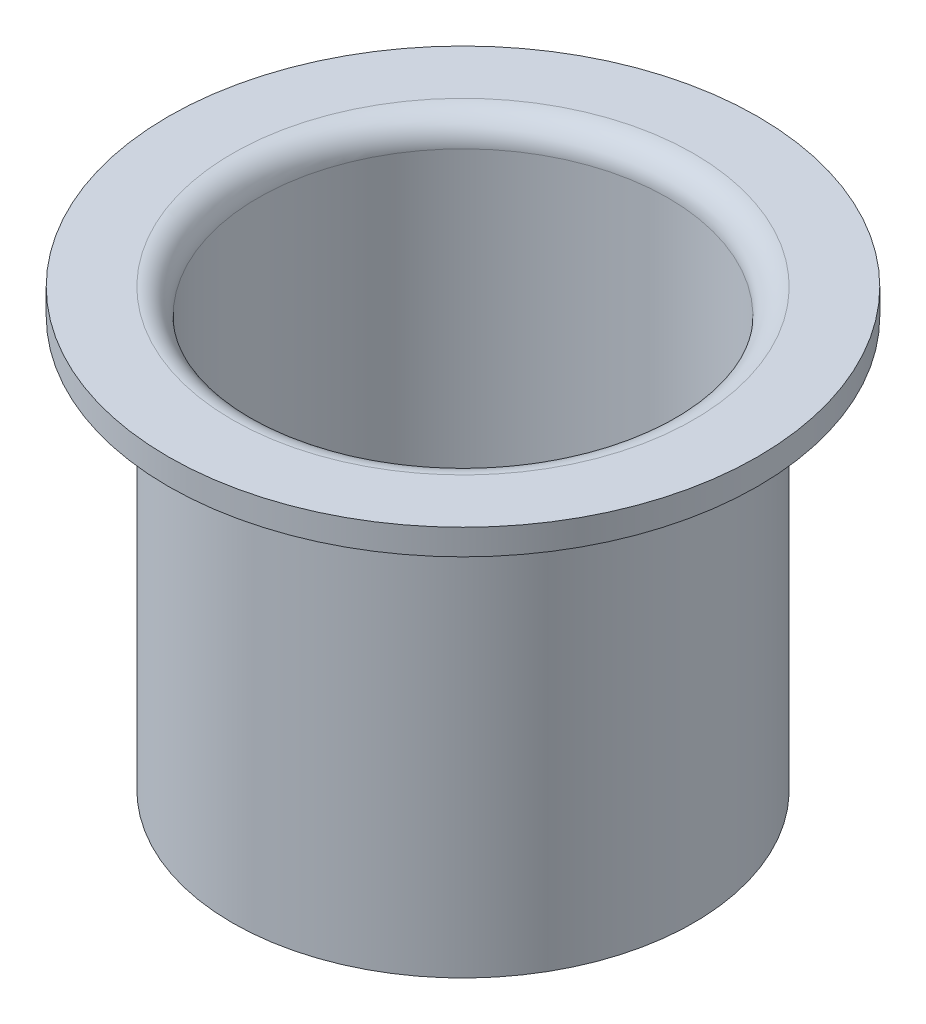
ISO-10303-21;
HEADER;
FILE_DESCRIPTION(('STEP AP214'),'2;1');
FILE_NAME('part.step','',(''),(''),'','','');
FILE_SCHEMA(('AUTOMOTIVE_DESIGN { 1 0 10303 214 1 1 1 1 }'));
ENDSEC;
DATA;
#1=APPLICATION_CONTEXT('core data for automotive mechanical design processes');
#2=APPLICATION_PROTOCOL_DEFINITION('international standard','automotive_design',2000,#1);
#3=PRODUCT_CONTEXT('',#1,'mechanical');
#4=PRODUCT('Part','Part','',(#3));
#5=PRODUCT_RELATED_PRODUCT_CATEGORY('part','',(#4));
#6=PRODUCT_DEFINITION_FORMATION('','',#4);
#7=PRODUCT_DEFINITION_CONTEXT('part definition',#1,'design');
#8=PRODUCT_DEFINITION('design','',#6,#7);
#9=PRODUCT_DEFINITION_SHAPE('','',#8);
#10=(LENGTH_UNIT() NAMED_UNIT(*) SI_UNIT(.MILLI.,.METRE.));
#11=(NAMED_UNIT(*) PLANE_ANGLE_UNIT() SI_UNIT($,.RADIAN.));
#12=(NAMED_UNIT(*) SI_UNIT($,.STERADIAN.) SOLID_ANGLE_UNIT());
#13=UNCERTAINTY_MEASURE_WITH_UNIT(LENGTH_MEASURE(1.E-05),#10,'distance_accuracy_value','');
#14=(GEOMETRIC_REPRESENTATION_CONTEXT(3) GLOBAL_UNCERTAINTY_ASSIGNED_CONTEXT((#13)) GLOBAL_UNIT_ASSIGNED_CONTEXT((#10,
#11,#12)) REPRESENTATION_CONTEXT('',''));
#15=CARTESIAN_POINT('',(0.,0.,0.));
#16=DIRECTION('',(0.,0.,1.));
#17=DIRECTION('',(1.,0.,0.));
#18=AXIS2_PLACEMENT_3D('',#15,#16,#17);
#19=CARTESIAN_POINT('',(0.,16.9065466566589,-9.00000000000001));
#20=DIRECTION('',(0.,-1.,0.));
#21=DIRECTION('',(0.,0.,-1.));
#22=AXIS2_PLACEMENT_3D('',#19,#20,#21);
#23=PLANE('',#22);
#24=CARTESIAN_POINT('',(0.,16.9065466566589,0.));
#25=DIRECTION('',(0.,-1.,0.));
#26=DIRECTION('',(0.,0.,-1.));
#27=AXIS2_PLACEMENT_3D('',#24,#25,#26);
#28=CIRCLE('',#27,11.5);
#29=CARTESIAN_POINT('',(0.,16.9065466566589,-11.5));
#30=VERTEX_POINT('',#29);
#31=EDGE_CURVE('E68',#30,#30,#28,.T.);
#32=ORIENTED_EDGE('',*,*,#31,.T.);
#33=EDGE_LOOP('',(#32));
#34=FACE_BOUND('',#33,.T.);
#35=CARTESIAN_POINT('',(0.,16.9065466566589,0.));
#36=DIRECTION('',(0.,-1.,0.));
#37=DIRECTION('',(0.,0.,-1.));
#38=AXIS2_PLACEMENT_3D('',#35,#36,#37);
#39=CIRCLE('',#38,9.);
#40=CARTESIAN_POINT('',(0.,16.9065466566589,-9.));
#41=VERTEX_POINT('',#40);
#42=EDGE_CURVE('E10',#41,#41,#39,.T.);
#43=ORIENTED_EDGE('',*,*,#42,.F.);
#44=EDGE_LOOP('',(#43));
#45=FACE_BOUND('',#44,.T.);
#46=ADVANCED_FACE('F36',(#34,#45),#23,.T.);
#47=CARTESIAN_POINT('',(0.,0.,0.));
#48=DIRECTION('',(0.,-1.,0.));
#49=DIRECTION('',(0.,0.,-1.));
#50=AXIS2_PLACEMENT_3D('',#47,#48,#49);
#51=CYLINDRICAL_SURFACE('',#50,9.);
#52=ORIENTED_EDGE('',*,*,#42,.T.);
#53=EDGE_LOOP('',(#52));
#54=FACE_BOUND('',#53,.T.);
#55=CARTESIAN_POINT('',(0.,0.906546656658888,0.));
#56=DIRECTION('',(0.,-1.,0.));
#57=DIRECTION('',(0.,0.,-1.));
#58=AXIS2_PLACEMENT_3D('',#55,#56,#57);
#59=CIRCLE('',#58,9.);
#60=CARTESIAN_POINT('',(0.,0.906546656658888,-9.));
#61=VERTEX_POINT('',#60);
#62=EDGE_CURVE('E43',#61,#61,#59,.T.);
#63=ORIENTED_EDGE('',*,*,#62,.F.);
#64=EDGE_LOOP('',(#63));
#65=FACE_BOUND('',#64,.T.);
#66=ADVANCED_FACE('F100',(#54,#65),#51,.T.);
#67=CARTESIAN_POINT('',(0.,0.906546656658888,-9.));
#68=DIRECTION('',(0.,1.,0.));
#69=DIRECTION('',(0.,0.,1.));
#70=AXIS2_PLACEMENT_3D('',#67,#68,#69);
#71=PLANE('',#70);
#72=CARTESIAN_POINT('',(0.,0.906546656658888,0.));
#73=DIRECTION('',(0.,-1.,0.));
#74=DIRECTION('',(0.,0.,-1.));
#75=AXIS2_PLACEMENT_3D('',#72,#73,#74);
#76=CIRCLE('',#75,8.);
#77=CARTESIAN_POINT('',(0.,0.906546656658888,-8.));
#78=VERTEX_POINT('',#77);
#79=EDGE_CURVE('E50',#78,#78,#76,.T.);
#80=ORIENTED_EDGE('',*,*,#79,.F.);
#81=EDGE_LOOP('',(#80));
#82=FACE_BOUND('',#81,.T.);
#83=ORIENTED_EDGE('',*,*,#62,.T.);
#84=EDGE_LOOP('',(#83));
#85=FACE_BOUND('',#84,.T.);
#86=ADVANCED_FACE('F95',(#82,#85),#71,.F.);
#87=CARTESIAN_POINT('',(0.,0.,0.));
#88=DIRECTION('',(0.,-1.,0.));
#89=DIRECTION('',(0.,0.,-1.));
#90=AXIS2_PLACEMENT_3D('',#87,#88,#89);
#91=CYLINDRICAL_SURFACE('',#90,8.);
#92=CARTESIAN_POINT('',(0.,16.9065466566589,0.));
#93=DIRECTION('',(0.,-1.,0.));
#94=DIRECTION('',(0.,0.,-1.));
#95=AXIS2_PLACEMENT_3D('',#92,#93,#94);
#96=CIRCLE('',#95,8.);
#97=CARTESIAN_POINT('',(0.,16.9065466566589,-8.));
#98=VERTEX_POINT('',#97);
#99=EDGE_CURVE('E55',#98,#98,#96,.T.);
#100=ORIENTED_EDGE('',*,*,#99,.F.);
#101=EDGE_LOOP('',(#100));
#102=FACE_BOUND('',#101,.T.);
#103=ORIENTED_EDGE('',*,*,#79,.T.);
#104=EDGE_LOOP('',(#103));
#105=FACE_BOUND('',#104,.T.);
#106=ADVANCED_FACE('F89',(#102,#105),#91,.F.);
#107=CARTESIAN_POINT('',(0.,16.9065466566589,0.));
#108=DIRECTION('',(0.,-1.,0.));
#109=DIRECTION('',(0.,0.,-1.));
#110=AXIS2_PLACEMENT_3D('',#107,#108,#109);
#111=TOROIDAL_SURFACE('',#110,9.,1.);
#112=CARTESIAN_POINT('',(0.,17.9065466566589,0.));
#113=DIRECTION('',(0.,-1.,0.));
#114=DIRECTION('',(0.,0.,-1.));
#115=AXIS2_PLACEMENT_3D('',#112,#113,#114);
#116=CIRCLE('',#115,9.00000000000001);
#117=CARTESIAN_POINT('',(0.,17.9065466566589,-9.00000000000001));
#118=VERTEX_POINT('',#117);
#119=EDGE_CURVE('E60',#118,#118,#116,.T.);
#120=ORIENTED_EDGE('',*,*,#119,.F.);
#121=EDGE_LOOP('',(#120));
#122=FACE_BOUND('',#121,.T.);
#123=ORIENTED_EDGE('',*,*,#99,.T.);
#124=EDGE_LOOP('',(#123));
#125=FACE_BOUND('',#124,.T.);
#126=ADVANCED_FACE('F83',(#122,#125),#111,.T.);
#127=CARTESIAN_POINT('',(0.,17.9065466566589,-9.00000000000001));
#128=DIRECTION('',(0.,-1.,0.));
#129=DIRECTION('',(0.,0.,-1.));
#130=AXIS2_PLACEMENT_3D('',#127,#128,#129);
#131=PLANE('',#130);
#132=CARTESIAN_POINT('',(0.,17.9065466566589,0.));
#133=DIRECTION('',(0.,-1.,0.));
#134=DIRECTION('',(0.,0.,-1.));
#135=AXIS2_PLACEMENT_3D('',#132,#133,#134);
#136=CIRCLE('',#135,11.5);
#137=CARTESIAN_POINT('',(0.,17.9065466566589,-11.5));
#138=VERTEX_POINT('',#137);
#139=EDGE_CURVE('E64',#138,#138,#136,.T.);
#140=ORIENTED_EDGE('',*,*,#139,.F.);
#141=EDGE_LOOP('',(#140));
#142=FACE_BOUND('',#141,.T.);
#143=ORIENTED_EDGE('',*,*,#119,.T.);
#144=EDGE_LOOP('',(#143));
#145=FACE_BOUND('',#144,.T.);
#146=ADVANCED_FACE('F77',(#142,#145),#131,.F.);
#147=CARTESIAN_POINT('',(0.,0.,0.));
#148=DIRECTION('',(0.,-1.,0.));
#149=DIRECTION('',(0.,0.,-1.));
#150=AXIS2_PLACEMENT_3D('',#147,#148,#149);
#151=CYLINDRICAL_SURFACE('',#150,11.5);
#152=ORIENTED_EDGE('',*,*,#31,.F.);
#153=EDGE_LOOP('',(#152));
#154=FACE_BOUND('',#153,.T.);
#155=ORIENTED_EDGE('',*,*,#139,.T.);
#156=EDGE_LOOP('',(#155));
#157=FACE_BOUND('',#156,.T.);
#158=ADVANCED_FACE('F74',(#154,#157),#151,.T.);
#159=CLOSED_SHELL('',(#46,#66,#86,#106,#126,#146,#158));
#160=MANIFOLD_SOLID_BREP('B2',#159);
#161=ADVANCED_BREP_SHAPE_REPRESENTATION('',(#18,#160),#14);
#162=SHAPE_DEFINITION_REPRESENTATION(#9,#161);
ENDSEC;
END-ISO-10303-21;
